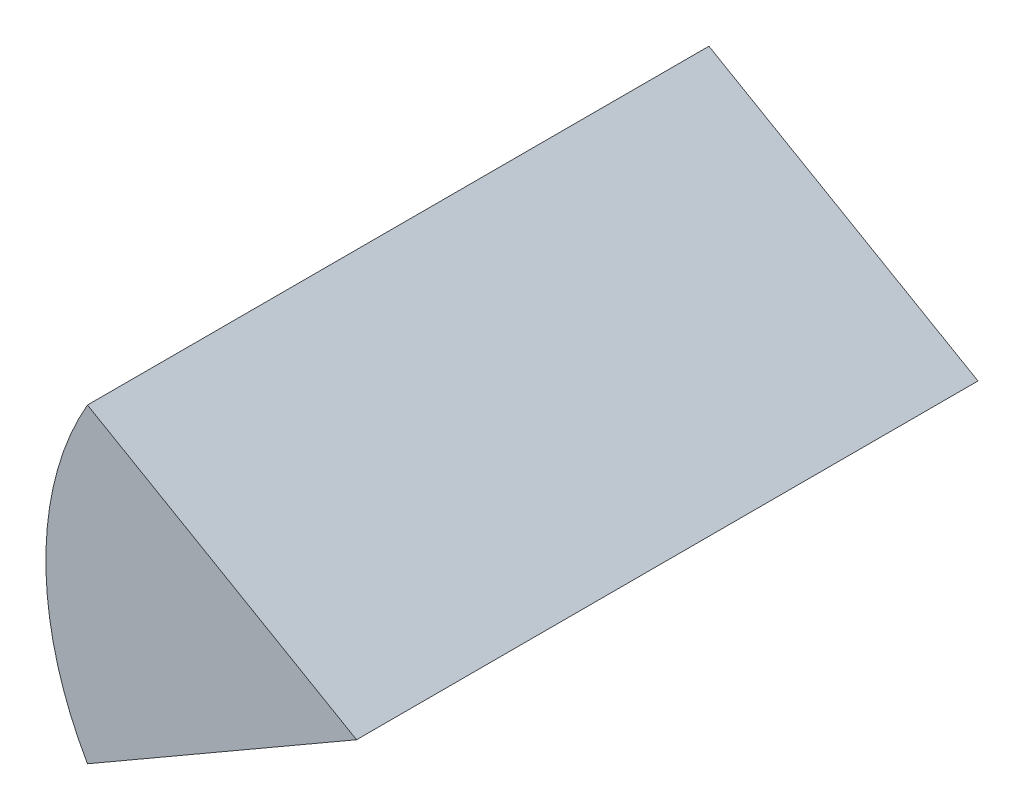
ISO-10303-21;
HEADER;
FILE_DESCRIPTION(('STEP AP214'),'2;1');
FILE_NAME('part.step','',(''),(''),'','','');
FILE_SCHEMA(('AUTOMOTIVE_DESIGN { 1 0 10303 214 1 1 1 1 }'));
ENDSEC;
DATA;
#1=APPLICATION_CONTEXT('core data for automotive mechanical design processes');
#2=APPLICATION_PROTOCOL_DEFINITION('international standard','automotive_design',2000,#1);
#3=PRODUCT_CONTEXT('',#1,'mechanical');
#4=PRODUCT('Part','Part','',(#3));
#5=PRODUCT_RELATED_PRODUCT_CATEGORY('part','',(#4));
#6=PRODUCT_DEFINITION_FORMATION('','',#4);
#7=PRODUCT_DEFINITION_CONTEXT('part definition',#1,'design');
#8=PRODUCT_DEFINITION('design','',#6,#7);
#9=PRODUCT_DEFINITION_SHAPE('','',#8);
#10=(LENGTH_UNIT() NAMED_UNIT(*) SI_UNIT(.MILLI.,.METRE.));
#11=(NAMED_UNIT(*) PLANE_ANGLE_UNIT() SI_UNIT($,.RADIAN.));
#12=(NAMED_UNIT(*) SI_UNIT($,.STERADIAN.) SOLID_ANGLE_UNIT());
#13=UNCERTAINTY_MEASURE_WITH_UNIT(LENGTH_MEASURE(1.E-05),#10,'distance_accuracy_value','');
#14=(GEOMETRIC_REPRESENTATION_CONTEXT(3) GLOBAL_UNCERTAINTY_ASSIGNED_CONTEXT((#13)) GLOBAL_UNIT_ASSIGNED_CONTEXT((#10,
#11,#12)) REPRESENTATION_CONTEXT('',''));
#15=CARTESIAN_POINT('',(0.,0.,0.));
#16=DIRECTION('',(0.,0.,1.));
#17=DIRECTION('',(1.,0.,0.));
#18=AXIS2_PLACEMENT_3D('',#15,#16,#17);
#19=CARTESIAN_POINT('',(0.,0.,50.));
#20=DIRECTION('',(-0.499999999999998,0.86602540378444,0.));
#21=DIRECTION('',(-0.86602540378444,-0.499999999999998,0.));
#22=AXIS2_PLACEMENT_3D('',#19,#20,#21);
#23=PLANE('',#22);
#24=DIRECTION('',(0.86602540378444,0.499999999999998,0.));
#25=VECTOR('',#24,1.);
#26=CARTESIAN_POINT('',(0.,0.,0.));
#27=LINE('',#26,#25);
#28=CARTESIAN_POINT('',(-21.650635094611,-12.5,0.));
#29=VERTEX_POINT('',#28);
#30=CARTESIAN_POINT('',(0.,0.,0.));
#31=VERTEX_POINT('',#30);
#32=EDGE_CURVE('E80',#29,#31,#27,.T.);
#33=ORIENTED_EDGE('',*,*,#32,.T.);
#34=DIRECTION('',(0.,0.,-1.));
#35=VECTOR('',#34,1.);
#36=CARTESIAN_POINT('',(0.,0.,50.));
#37=LINE('',#36,#35);
#38=CARTESIAN_POINT('',(0.,0.,50.));
#39=VERTEX_POINT('',#38);
#40=EDGE_CURVE('E11',#39,#31,#37,.T.);
#41=ORIENTED_EDGE('',*,*,#40,.F.);
#42=DIRECTION('',(0.86602540378444,0.499999999999998,0.));
#43=VECTOR('',#42,1.);
#44=CARTESIAN_POINT('',(0.,0.,50.));
#45=LINE('',#44,#43);
#46=CARTESIAN_POINT('',(-21.650635094611,-12.5,50.));
#47=VERTEX_POINT('',#46);
#48=EDGE_CURVE('E73',#47,#39,#45,.T.);
#49=ORIENTED_EDGE('',*,*,#48,.F.);
#50=DIRECTION('',(0.,0.,-1.));
#51=VECTOR('',#50,1.);
#52=CARTESIAN_POINT('',(-21.650635094611,-12.5,50.));
#53=LINE('',#52,#51);
#54=EDGE_CURVE('E81',#47,#29,#53,.T.);
#55=ORIENTED_EDGE('',*,*,#54,.T.);
#56=EDGE_LOOP('',(#33,#41,#49,#55));
#57=FACE_BOUND('',#56,.T.);
#58=ADVANCED_FACE('F33',(#57),#23,.F.);
#59=CARTESIAN_POINT('',(0.,0.,50.));
#60=DIRECTION('',(-0.500000000000002,-0.866025403784438,0.));
#61=DIRECTION('',(0.866025403784438,-0.500000000000002,0.));
#62=AXIS2_PLACEMENT_3D('',#59,#60,#61);
#63=PLANE('',#62);
#64=DIRECTION('',(-0.866025403784438,0.500000000000002,0.));
#65=VECTOR('',#64,1.);
#66=CARTESIAN_POINT('',(0.,0.,0.));
#67=LINE('',#66,#65);
#68=CARTESIAN_POINT('',(-21.6506350946109,12.5,0.));
#69=VERTEX_POINT('',#68);
#70=EDGE_CURVE('E61',#31,#69,#67,.T.);
#71=ORIENTED_EDGE('',*,*,#70,.T.);
#72=DIRECTION('',(0.,0.,-1.));
#73=VECTOR('',#72,1.);
#74=CARTESIAN_POINT('',(-21.6506350946109,12.5,50.));
#75=LINE('',#74,#73);
#76=CARTESIAN_POINT('',(-21.6506350946109,12.5,50.));
#77=VERTEX_POINT('',#76);
#78=EDGE_CURVE('E41',#77,#69,#75,.T.);
#79=ORIENTED_EDGE('',*,*,#78,.F.);
#80=DIRECTION('',(-0.866025403784438,0.500000000000002,0.));
#81=VECTOR('',#80,1.);
#82=CARTESIAN_POINT('',(0.,0.,50.));
#83=LINE('',#82,#81);
#84=EDGE_CURVE('E69',#39,#77,#83,.T.);
#85=ORIENTED_EDGE('',*,*,#84,.F.);
#86=ORIENTED_EDGE('',*,*,#40,.T.);
#87=EDGE_LOOP('',(#71,#79,#85,#86));
#88=FACE_BOUND('',#87,.T.);
#89=ADVANCED_FACE('F70',(#88),#63,.F.);
#90=CARTESIAN_POINT('',(0.,0.,50.));
#91=DIRECTION('',(0.,0.,-1.));
#92=DIRECTION('',(-1.,0.,0.));
#93=AXIS2_PLACEMENT_3D('',#90,#91,#92);
#94=CYLINDRICAL_SURFACE('',#93,25.);
#95=CARTESIAN_POINT('',(0.,0.,0.));
#96=DIRECTION('',(0.,0.,1.));
#97=DIRECTION('',(1.,0.,0.));
#98=AXIS2_PLACEMENT_3D('',#95,#96,#97);
#99=CIRCLE('',#98,25.);
#100=EDGE_CURVE('E66',#69,#29,#99,.T.);
#101=ORIENTED_EDGE('',*,*,#100,.T.);
#102=ORIENTED_EDGE('',*,*,#54,.F.);
#103=CARTESIAN_POINT('',(0.,0.,50.));
#104=DIRECTION('',(0.,0.,1.));
#105=DIRECTION('',(1.,0.,0.));
#106=AXIS2_PLACEMENT_3D('',#103,#104,#105);
#107=CIRCLE('',#106,25.);
#108=EDGE_CURVE('E49',#77,#47,#107,.T.);
#109=ORIENTED_EDGE('',*,*,#108,.F.);
#110=ORIENTED_EDGE('',*,*,#78,.T.);
#111=EDGE_LOOP('',(#101,#102,#109,#110));
#112=FACE_BOUND('',#111,.T.);
#113=ADVANCED_FACE('F92',(#112),#94,.T.);
#114=CARTESIAN_POINT('',(0.,0.,50.));
#115=DIRECTION('',(0.,0.,1.));
#116=DIRECTION('',(1.,0.,0.));
#117=AXIS2_PLACEMENT_3D('',#114,#115,#116);
#118=PLANE('',#117);
#119=ORIENTED_EDGE('',*,*,#48,.T.);
#120=ORIENTED_EDGE('',*,*,#84,.T.);
#121=ORIENTED_EDGE('',*,*,#108,.T.);
#122=EDGE_LOOP('',(#119,#120,#121));
#123=FACE_BOUND('',#122,.T.);
#124=ADVANCED_FACE('F76',(#123),#118,.T.);
#125=CARTESIAN_POINT('',(0.,0.,0.));
#126=DIRECTION('',(0.,0.,1.));
#127=DIRECTION('',(1.,0.,0.));
#128=AXIS2_PLACEMENT_3D('',#125,#126,#127);
#129=PLANE('',#128);
#130=CARTESIAN_POINT('',(-15.7714935461706,0.,0.));
#131=DIRECTION('',(0.,0.,-1.));
#132=DIRECTION('',(-1.,0.,0.));
#133=AXIS2_PLACEMENT_3D('',#130,#131,#132);
#134=CIRCLE('',#133,5.);
#135=CARTESIAN_POINT('',(-20.7714935461706,0.,0.));
#136=VERTEX_POINT('',#135);
#137=EDGE_CURVE('E87',#136,#136,#134,.T.);
#138=ORIENTED_EDGE('',*,*,#137,.F.);
#139=EDGE_LOOP('',(#138));
#140=FACE_BOUND('',#139,.T.);
#141=ORIENTED_EDGE('',*,*,#32,.F.);
#142=ORIENTED_EDGE('',*,*,#100,.F.);
#143=ORIENTED_EDGE('',*,*,#70,.F.);
#144=EDGE_LOOP('',(#141,#142,#143));
#145=FACE_BOUND('',#144,.T.);
#146=ADVANCED_FACE('F93',(#140,#145),#129,.F.);
#147=CARTESIAN_POINT('',(-15.7714935461706,0.,10.));
#148=DIRECTION('',(0.,0.,-1.));
#149=DIRECTION('',(-1.,0.,0.));
#150=AXIS2_PLACEMENT_3D('',#147,#148,#149);
#151=CYLINDRICAL_SURFACE('',#150,5.);
#152=CARTESIAN_POINT('',(-15.7714935461706,0.,10.));
#153=DIRECTION('',(0.,0.,-1.));
#154=DIRECTION('',(-1.,0.,0.));
#155=AXIS2_PLACEMENT_3D('',#152,#153,#154);
#156=CIRCLE('',#155,5.);
#157=CARTESIAN_POINT('',(-20.7714935461706,0.,10.));
#158=VERTEX_POINT('',#157);
#159=EDGE_CURVE('E83',#158,#158,#156,.T.);
#160=ORIENTED_EDGE('',*,*,#159,.F.);
#161=EDGE_LOOP('',(#160));
#162=FACE_BOUND('',#161,.T.);
#163=ORIENTED_EDGE('',*,*,#137,.T.);
#164=EDGE_LOOP('',(#163));
#165=FACE_BOUND('',#164,.T.);
#166=ADVANCED_FACE('F95',(#162,#165),#151,.F.);
#167=CARTESIAN_POINT('',(-15.7714935461706,0.,10.));
#168=DIRECTION('',(0.,0.,-1.));
#169=DIRECTION('',(-1.,0.,0.));
#170=AXIS2_PLACEMENT_3D('',#167,#168,#169);
#171=PLANE('',#170);
#172=ORIENTED_EDGE('',*,*,#159,.T.);
#173=EDGE_LOOP('',(#172));
#174=FACE_BOUND('',#173,.T.);
#175=ADVANCED_FACE('F102',(#174),#171,.T.);
#176=CLOSED_SHELL('',(#58,#89,#113,#124,#146,#166,#175));
#177=MANIFOLD_SOLID_BREP('B2',#176);
#178=ADVANCED_BREP_SHAPE_REPRESENTATION('',(#18,#177),#14);
#179=SHAPE_DEFINITION_REPRESENTATION(#9,#178);
ENDSEC;
END-ISO-10303-21;
